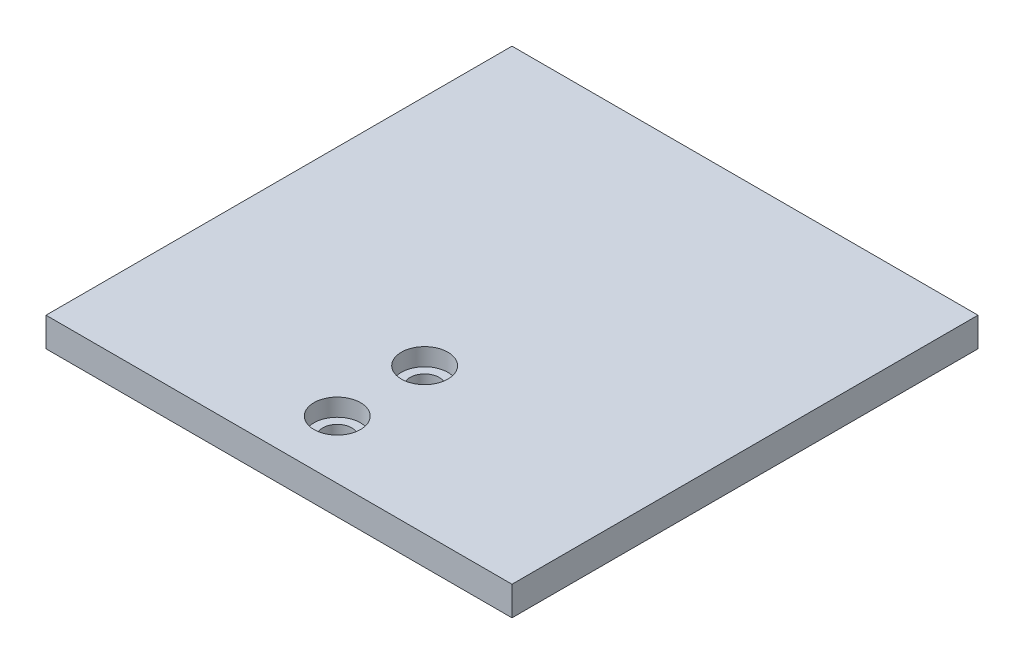
ISO-10303-21;
HEADER;
FILE_DESCRIPTION(('STEP AP214'),'2;1');
FILE_NAME('part.step','',(''),(''),'','','');
FILE_SCHEMA(('AUTOMOTIVE_DESIGN { 1 0 10303 214 1 1 1 1 }'));
ENDSEC;
DATA;
#1=APPLICATION_CONTEXT('core data for automotive mechanical design processes');
#2=APPLICATION_PROTOCOL_DEFINITION('international standard','automotive_design',2000,#1);
#3=PRODUCT_CONTEXT('',#1,'mechanical');
#4=PRODUCT('Part','Part','',(#3));
#5=PRODUCT_RELATED_PRODUCT_CATEGORY('part','',(#4));
#6=PRODUCT_DEFINITION_FORMATION('','',#4);
#7=PRODUCT_DEFINITION_CONTEXT('part definition',#1,'design');
#8=PRODUCT_DEFINITION('design','',#6,#7);
#9=PRODUCT_DEFINITION_SHAPE('','',#8);
#10=(LENGTH_UNIT() NAMED_UNIT(*) SI_UNIT(.MILLI.,.METRE.));
#11=(NAMED_UNIT(*) PLANE_ANGLE_UNIT() SI_UNIT($,.RADIAN.));
#12=(NAMED_UNIT(*) SI_UNIT($,.STERADIAN.) SOLID_ANGLE_UNIT());
#13=UNCERTAINTY_MEASURE_WITH_UNIT(LENGTH_MEASURE(1.E-05),#10,'distance_accuracy_value','');
#14=(GEOMETRIC_REPRESENTATION_CONTEXT(3) GLOBAL_UNCERTAINTY_ASSIGNED_CONTEXT((#13)) GLOBAL_UNIT_ASSIGNED_CONTEXT((#10,
#11,#12)) REPRESENTATION_CONTEXT('',''));
#15=CARTESIAN_POINT('',(0.,0.,0.));
#16=DIRECTION('',(0.,0.,1.));
#17=DIRECTION('',(1.,0.,0.));
#18=AXIS2_PLACEMENT_3D('',#15,#16,#17);
#19=CARTESIAN_POINT('',(0.,-10.,30.));
#20=DIRECTION('',(0.,1.,0.));
#21=DIRECTION('',(0.,0.,1.));
#22=AXIS2_PLACEMENT_3D('',#19,#20,#21);
#23=CYLINDRICAL_SURFACE('',#22,2.5);
#24=CARTESIAN_POINT('',(0.,0.,30.));
#25=DIRECTION('',(0.,1.,0.));
#26=DIRECTION('',(0.,0.,1.));
#27=AXIS2_PLACEMENT_3D('',#24,#25,#26);
#28=CIRCLE('',#27,2.5);
#29=CARTESIAN_POINT('',(0.,0.,32.5));
#30=VERTEX_POINT('',#29);
#31=EDGE_CURVE('E111',#30,#30,#28,.T.);
#32=ORIENTED_EDGE('',*,*,#31,.F.);
#33=EDGE_LOOP('',(#32));
#34=FACE_BOUND('',#33,.T.);
#35=CARTESIAN_POINT('',(0.,2.,30.));
#36=DIRECTION('',(0.,1.,0.));
#37=DIRECTION('',(0.,0.,1.));
#38=AXIS2_PLACEMENT_3D('',#35,#36,#37);
#39=CIRCLE('',#38,2.5);
#40=CARTESIAN_POINT('',(0.,2.,32.5));
#41=VERTEX_POINT('',#40);
#42=EDGE_CURVE('E37',#41,#41,#39,.F.);
#43=ORIENTED_EDGE('',*,*,#42,.F.);
#44=EDGE_LOOP('',(#43));
#45=FACE_BOUND('',#44,.T.);
#46=ADVANCED_FACE('F33',(#34,#45),#23,.F.);
#47=CARTESIAN_POINT('',(0.,-10.,15.));
#48=DIRECTION('',(0.,1.,0.));
#49=DIRECTION('',(0.,0.,1.));
#50=AXIS2_PLACEMENT_3D('',#47,#48,#49);
#51=CYLINDRICAL_SURFACE('',#50,2.5);
#52=CARTESIAN_POINT('',(0.,0.,15.));
#53=DIRECTION('',(0.,1.,0.));
#54=DIRECTION('',(0.,0.,1.));
#55=AXIS2_PLACEMENT_3D('',#52,#53,#54);
#56=CIRCLE('',#55,2.5);
#57=CARTESIAN_POINT('',(0.,0.,17.5));
#58=VERTEX_POINT('',#57);
#59=EDGE_CURVE('E103',#58,#58,#56,.T.);
#60=ORIENTED_EDGE('',*,*,#59,.F.);
#61=EDGE_LOOP('',(#60));
#62=FACE_BOUND('',#61,.T.);
#63=CARTESIAN_POINT('',(0.,2.,15.));
#64=DIRECTION('',(0.,1.,0.));
#65=DIRECTION('',(0.,0.,1.));
#66=AXIS2_PLACEMENT_3D('',#63,#64,#65);
#67=CIRCLE('',#66,2.5);
#68=CARTESIAN_POINT('',(0.,2.,17.5));
#69=VERTEX_POINT('',#68);
#70=EDGE_CURVE('E113',#69,#69,#67,.F.);
#71=ORIENTED_EDGE('',*,*,#70,.F.);
#72=EDGE_LOOP('',(#71));
#73=FACE_BOUND('',#72,.T.);
#74=ADVANCED_FACE('F139',(#62,#73),#51,.F.);
#75=CARTESIAN_POINT('',(-40.,5.,40.));
#76=DIRECTION('',(1.,0.,0.));
#77=DIRECTION('',(0.,0.,-1.));
#78=AXIS2_PLACEMENT_3D('',#75,#76,#77);
#79=PLANE('',#78);
#80=DIRECTION('',(0.,0.,1.));
#81=VECTOR('',#80,1.);
#82=CARTESIAN_POINT('',(-40.,0.,40.));
#83=LINE('',#82,#81);
#84=CARTESIAN_POINT('',(-40.,0.,-40.));
#85=VERTEX_POINT('',#84);
#86=CARTESIAN_POINT('',(-40.,0.,40.));
#87=VERTEX_POINT('',#86);
#88=EDGE_CURVE('E100',#85,#87,#83,.T.);
#89=ORIENTED_EDGE('',*,*,#88,.T.);
#90=DIRECTION('',(0.,-1.,0.));
#91=VECTOR('',#90,1.);
#92=CARTESIAN_POINT('',(-40.,5.,40.));
#93=LINE('',#92,#91);
#94=CARTESIAN_POINT('',(-40.,5.,40.));
#95=VERTEX_POINT('',#94);
#96=EDGE_CURVE('E11',#95,#87,#93,.T.);
#97=ORIENTED_EDGE('',*,*,#96,.F.);
#98=DIRECTION('',(0.,0.,1.));
#99=VECTOR('',#98,1.);
#100=CARTESIAN_POINT('',(-40.,5.,40.));
#101=LINE('',#100,#99);
#102=CARTESIAN_POINT('',(-40.,5.,-40.));
#103=VERTEX_POINT('',#102);
#104=EDGE_CURVE('E87',#103,#95,#101,.T.);
#105=ORIENTED_EDGE('',*,*,#104,.F.);
#106=DIRECTION('',(0.,-1.,0.));
#107=VECTOR('',#106,1.);
#108=CARTESIAN_POINT('',(-40.,5.,-40.));
#109=LINE('',#108,#107);
#110=EDGE_CURVE('E96',#103,#85,#109,.T.);
#111=ORIENTED_EDGE('',*,*,#110,.T.);
#112=EDGE_LOOP('',(#89,#97,#105,#111));
#113=FACE_BOUND('',#112,.T.);
#114=ADVANCED_FACE('F35',(#113),#79,.F.);
#115=CARTESIAN_POINT('',(40.,5.,40.));
#116=DIRECTION('',(0.,0.,-1.));
#117=DIRECTION('',(-1.,0.,0.));
#118=AXIS2_PLACEMENT_3D('',#115,#116,#117);
#119=PLANE('',#118);
#120=DIRECTION('',(1.,0.,0.));
#121=VECTOR('',#120,1.);
#122=CARTESIAN_POINT('',(40.,0.,40.));
#123=LINE('',#122,#121);
#124=CARTESIAN_POINT('',(40.,0.,40.));
#125=VERTEX_POINT('',#124);
#126=EDGE_CURVE('E91',#87,#125,#123,.T.);
#127=ORIENTED_EDGE('',*,*,#126,.T.);
#128=DIRECTION('',(0.,-1.,0.));
#129=VECTOR('',#128,1.);
#130=CARTESIAN_POINT('',(40.,5.,40.));
#131=LINE('',#130,#129);
#132=CARTESIAN_POINT('',(40.,5.,40.));
#133=VERTEX_POINT('',#132);
#134=EDGE_CURVE('E43',#133,#125,#131,.T.);
#135=ORIENTED_EDGE('',*,*,#134,.F.);
#136=DIRECTION('',(1.,0.,0.));
#137=VECTOR('',#136,1.);
#138=CARTESIAN_POINT('',(40.,5.,40.));
#139=LINE('',#138,#137);
#140=EDGE_CURVE('E82',#95,#133,#139,.T.);
#141=ORIENTED_EDGE('',*,*,#140,.F.);
#142=ORIENTED_EDGE('',*,*,#96,.T.);
#143=EDGE_LOOP('',(#127,#135,#141,#142));
#144=FACE_BOUND('',#143,.T.);
#145=ADVANCED_FACE('F90',(#144),#119,.F.);
#146=CARTESIAN_POINT('',(40.,5.,40.));
#147=DIRECTION('',(-1.,0.,0.));
#148=DIRECTION('',(0.,0.,1.));
#149=AXIS2_PLACEMENT_3D('',#146,#147,#148);
#150=PLANE('',#149);
#151=DIRECTION('',(0.,0.,-1.));
#152=VECTOR('',#151,1.);
#153=CARTESIAN_POINT('',(40.,0.,40.));
#154=LINE('',#153,#152);
#155=CARTESIAN_POINT('',(40.,0.,-40.));
#156=VERTEX_POINT('',#155);
#157=EDGE_CURVE('E69',#125,#156,#154,.T.);
#158=ORIENTED_EDGE('',*,*,#157,.T.);
#159=DIRECTION('',(0.,-1.,0.));
#160=VECTOR('',#159,1.);
#161=CARTESIAN_POINT('',(40.,5.,-40.));
#162=LINE('',#161,#160);
#163=CARTESIAN_POINT('',(40.,5.,-40.));
#164=VERTEX_POINT('',#163);
#165=EDGE_CURVE('E92',#164,#156,#162,.T.);
#166=ORIENTED_EDGE('',*,*,#165,.F.);
#167=DIRECTION('',(0.,0.,-1.));
#168=VECTOR('',#167,1.);
#169=CARTESIAN_POINT('',(40.,5.,40.));
#170=LINE('',#169,#168);
#171=EDGE_CURVE('E85',#133,#164,#170,.T.);
#172=ORIENTED_EDGE('',*,*,#171,.F.);
#173=ORIENTED_EDGE('',*,*,#134,.T.);
#174=EDGE_LOOP('',(#158,#166,#172,#173));
#175=FACE_BOUND('',#174,.T.);
#176=ADVANCED_FACE('F94',(#175),#150,.F.);
#177=CARTESIAN_POINT('',(40.,5.,-40.));
#178=DIRECTION('',(0.,0.,1.));
#179=DIRECTION('',(1.,0.,0.));
#180=AXIS2_PLACEMENT_3D('',#177,#178,#179);
#181=PLANE('',#180);
#182=DIRECTION('',(-1.,0.,0.));
#183=VECTOR('',#182,1.);
#184=CARTESIAN_POINT('',(40.,0.,-40.));
#185=LINE('',#184,#183);
#186=EDGE_CURVE('E75',#156,#85,#185,.T.);
#187=ORIENTED_EDGE('',*,*,#186,.T.);
#188=ORIENTED_EDGE('',*,*,#110,.F.);
#189=DIRECTION('',(-1.,0.,0.));
#190=VECTOR('',#189,1.);
#191=CARTESIAN_POINT('',(40.,5.,-40.));
#192=LINE('',#191,#190);
#193=EDGE_CURVE('E52',#164,#103,#192,.T.);
#194=ORIENTED_EDGE('',*,*,#193,.F.);
#195=ORIENTED_EDGE('',*,*,#165,.T.);
#196=EDGE_LOOP('',(#187,#188,#194,#195));
#197=FACE_BOUND('',#196,.T.);
#198=ADVANCED_FACE('F155',(#197),#181,.F.);
#199=CARTESIAN_POINT('',(0.,5.,0.));
#200=DIRECTION('',(0.,1.,0.));
#201=DIRECTION('',(0.,0.,1.));
#202=AXIS2_PLACEMENT_3D('',#199,#200,#201);
#203=PLANE('',#202);
#204=CARTESIAN_POINT('',(0.,5.,30.));
#205=DIRECTION('',(0.,1.,0.));
#206=DIRECTION('',(0.,0.,1.));
#207=AXIS2_PLACEMENT_3D('',#204,#205,#206);
#208=CIRCLE('',#207,4.);
#209=CARTESIAN_POINT('',(0.,5.,34.));
#210=VERTEX_POINT('',#209);
#211=EDGE_CURVE('E126',#210,#210,#208,.T.);
#212=ORIENTED_EDGE('',*,*,#211,.F.);
#213=EDGE_LOOP('',(#212));
#214=FACE_BOUND('',#213,.T.);
#215=CARTESIAN_POINT('',(0.,5.,15.));
#216=DIRECTION('',(0.,1.,0.));
#217=DIRECTION('',(0.,0.,1.));
#218=AXIS2_PLACEMENT_3D('',#215,#216,#217);
#219=CIRCLE('',#218,4.);
#220=CARTESIAN_POINT('',(0.,5.,19.));
#221=VERTEX_POINT('',#220);
#222=EDGE_CURVE('E119',#221,#221,#219,.T.);
#223=ORIENTED_EDGE('',*,*,#222,.F.);
#224=EDGE_LOOP('',(#223));
#225=FACE_BOUND('',#224,.T.);
#226=ORIENTED_EDGE('',*,*,#104,.T.);
#227=ORIENTED_EDGE('',*,*,#140,.T.);
#228=ORIENTED_EDGE('',*,*,#171,.T.);
#229=ORIENTED_EDGE('',*,*,#193,.T.);
#230=EDGE_LOOP('',(#226,#227,#228,#229));
#231=FACE_BOUND('',#230,.T.);
#232=ADVANCED_FACE('F83',(#214,#225,#231),#203,.T.);
#233=CARTESIAN_POINT('',(0.,0.,0.));
#234=DIRECTION('',(0.,1.,0.));
#235=DIRECTION('',(0.,0.,1.));
#236=AXIS2_PLACEMENT_3D('',#233,#234,#235);
#237=PLANE('',#236);
#238=ORIENTED_EDGE('',*,*,#31,.T.);
#239=EDGE_LOOP('',(#238));
#240=FACE_BOUND('',#239,.T.);
#241=ORIENTED_EDGE('',*,*,#59,.T.);
#242=EDGE_LOOP('',(#241));
#243=FACE_BOUND('',#242,.T.);
#244=ORIENTED_EDGE('',*,*,#88,.F.);
#245=ORIENTED_EDGE('',*,*,#186,.F.);
#246=ORIENTED_EDGE('',*,*,#157,.F.);
#247=ORIENTED_EDGE('',*,*,#126,.F.);
#248=EDGE_LOOP('',(#244,#245,#246,#247));
#249=FACE_BOUND('',#248,.T.);
#250=ADVANCED_FACE('F154',(#240,#243,#249),#237,.F.);
#251=CARTESIAN_POINT('',(0.,2.,15.));
#252=DIRECTION('',(0.,1.,0.));
#253=DIRECTION('',(0.,0.,1.));
#254=AXIS2_PLACEMENT_3D('',#251,#252,#253);
#255=PLANE('',#254);
#256=CARTESIAN_POINT('',(0.,2.,15.));
#257=DIRECTION('',(0.,1.,0.));
#258=DIRECTION('',(0.,0.,1.));
#259=AXIS2_PLACEMENT_3D('',#256,#257,#258);
#260=CIRCLE('',#259,4.);
#261=CARTESIAN_POINT('',(0.,2.,19.));
#262=VERTEX_POINT('',#261);
#263=EDGE_CURVE('E115',#262,#262,#260,.T.);
#264=ORIENTED_EDGE('',*,*,#263,.T.);
#265=EDGE_LOOP('',(#264));
#266=FACE_BOUND('',#265,.T.);
#267=ORIENTED_EDGE('',*,*,#70,.T.);
#268=EDGE_LOOP('',(#267));
#269=FACE_BOUND('',#268,.T.);
#270=ADVANCED_FACE('F159',(#266,#269),#255,.T.);
#271=CARTESIAN_POINT('',(0.,2.,15.));
#272=DIRECTION('',(0.,1.,0.));
#273=DIRECTION('',(0.,0.,1.));
#274=AXIS2_PLACEMENT_3D('',#271,#272,#273);
#275=CYLINDRICAL_SURFACE('',#274,4.);
#276=ORIENTED_EDGE('',*,*,#263,.F.);
#277=EDGE_LOOP('',(#276));
#278=FACE_BOUND('',#277,.T.);
#279=ORIENTED_EDGE('',*,*,#222,.T.);
#280=EDGE_LOOP('',(#279));
#281=FACE_BOUND('',#280,.T.);
#282=ADVANCED_FACE('F149',(#278,#281),#275,.F.);
#283=CARTESIAN_POINT('',(0.,2.,30.));
#284=DIRECTION('',(0.,1.,0.));
#285=DIRECTION('',(0.,0.,1.));
#286=AXIS2_PLACEMENT_3D('',#283,#284,#285);
#287=PLANE('',#286);
#288=CARTESIAN_POINT('',(0.,2.,30.));
#289=DIRECTION('',(0.,1.,0.));
#290=DIRECTION('',(0.,0.,1.));
#291=AXIS2_PLACEMENT_3D('',#288,#289,#290);
#292=CIRCLE('',#291,4.);
#293=CARTESIAN_POINT('',(0.,2.,34.));
#294=VERTEX_POINT('',#293);
#295=EDGE_CURVE('E129',#294,#294,#292,.T.);
#296=ORIENTED_EDGE('',*,*,#295,.T.);
#297=EDGE_LOOP('',(#296));
#298=FACE_BOUND('',#297,.T.);
#299=ORIENTED_EDGE('',*,*,#42,.T.);
#300=EDGE_LOOP('',(#299));
#301=FACE_BOUND('',#300,.T.);
#302=ADVANCED_FACE('F136',(#298,#301),#287,.T.);
#303=CARTESIAN_POINT('',(0.,2.,30.));
#304=DIRECTION('',(0.,1.,0.));
#305=DIRECTION('',(0.,0.,1.));
#306=AXIS2_PLACEMENT_3D('',#303,#304,#305);
#307=CYLINDRICAL_SURFACE('',#306,4.);
#308=ORIENTED_EDGE('',*,*,#295,.F.);
#309=EDGE_LOOP('',(#308));
#310=FACE_BOUND('',#309,.T.);
#311=ORIENTED_EDGE('',*,*,#211,.T.);
#312=EDGE_LOOP('',(#311));
#313=FACE_BOUND('',#312,.T.);
#314=ADVANCED_FACE('F212',(#310,#313),#307,.F.);
#315=CLOSED_SHELL('',(#46,#74,#114,#145,#176,#198,#232,#250,#270,#282,#302,#314));
#316=MANIFOLD_SOLID_BREP('B2',#315);
#317=ADVANCED_BREP_SHAPE_REPRESENTATION('',(#18,#316),#14);
#318=SHAPE_DEFINITION_REPRESENTATION(#9,#317);
ENDSEC;
END-ISO-10303-21;
